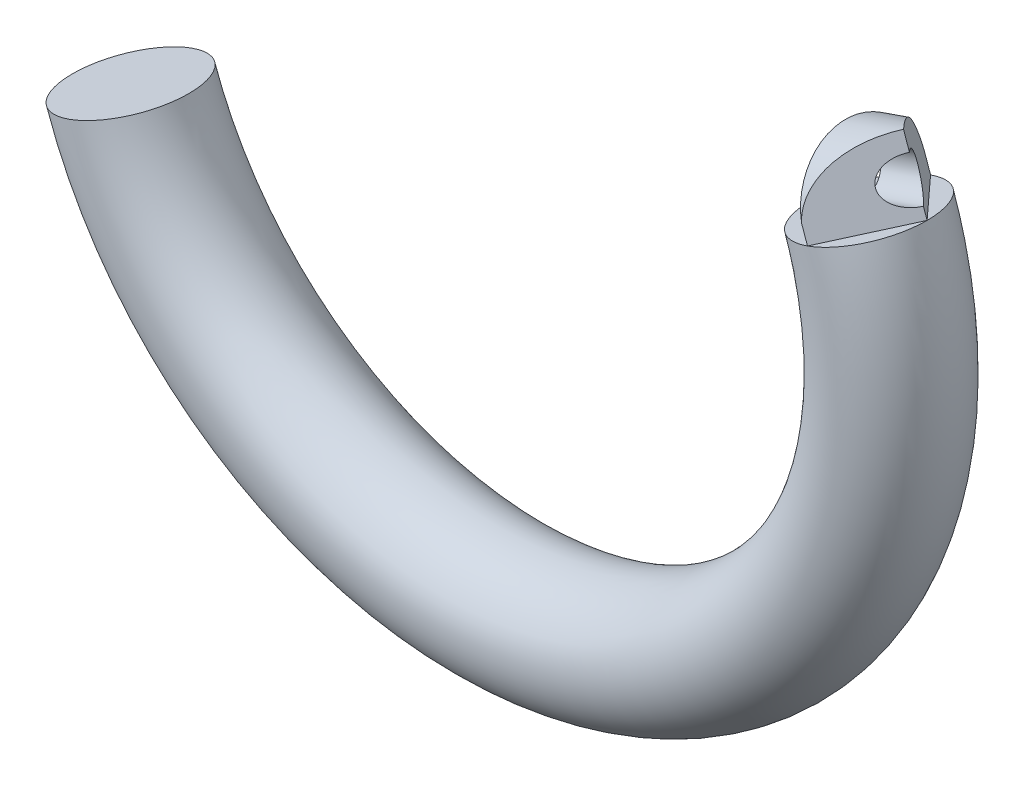
ISO-10303-21;
HEADER;
FILE_DESCRIPTION(('STEP AP214'),'2;1');
FILE_NAME('part.step','',(''),(''),'','','');
FILE_SCHEMA(('AUTOMOTIVE_DESIGN { 1 0 10303 214 1 1 1 1 }'));
ENDSEC;
DATA;
#1=APPLICATION_CONTEXT('core data for automotive mechanical design processes');
#2=APPLICATION_PROTOCOL_DEFINITION('international standard','automotive_design',2000,#1);
#3=PRODUCT_CONTEXT('',#1,'mechanical');
#4=PRODUCT('Part','Part','',(#3));
#5=PRODUCT_RELATED_PRODUCT_CATEGORY('part','',(#4));
#6=PRODUCT_DEFINITION_FORMATION('','',#4);
#7=PRODUCT_DEFINITION_CONTEXT('part definition',#1,'design');
#8=PRODUCT_DEFINITION('design','',#6,#7);
#9=PRODUCT_DEFINITION_SHAPE('','',#8);
#10=(LENGTH_UNIT() NAMED_UNIT(*) SI_UNIT(.MILLI.,.METRE.));
#11=(NAMED_UNIT(*) PLANE_ANGLE_UNIT() SI_UNIT($,.RADIAN.));
#12=(NAMED_UNIT(*) SI_UNIT($,.STERADIAN.) SOLID_ANGLE_UNIT());
#13=UNCERTAINTY_MEASURE_WITH_UNIT(LENGTH_MEASURE(1.E-05),#10,'distance_accuracy_value','');
#14=(GEOMETRIC_REPRESENTATION_CONTEXT(3) GLOBAL_UNCERTAINTY_ASSIGNED_CONTEXT((#13)) GLOBAL_UNIT_ASSIGNED_CONTEXT((#10,
#11,#12)) REPRESENTATION_CONTEXT('',''));
#15=CARTESIAN_POINT('',(0.,0.,0.));
#16=DIRECTION('',(0.,0.,1.));
#17=DIRECTION('',(1.,0.,0.));
#18=AXIS2_PLACEMENT_3D('',#15,#16,#17);
#19=CARTESIAN_POINT('',(22.0449897686221,41.8399595060842,-4.37500150229653));
#20=DIRECTION('',(0.943460139651132,0.33148599501256,0.));
#21=DIRECTION('',(-0.33148599501256,0.943460139651132,0.));
#22=AXIS2_PLACEMENT_3D('',#19,#20,#21);
#23=PLANE('',#22);
#24=CARTESIAN_POINT('',(24.6026708804798,34.5604055723353,0.));
#25=DIRECTION('',(-0.943460139651132,-0.33148599501256,0.));
#26=DIRECTION('',(0.33148599501256,-0.943460139651132,0.));
#27=AXIS2_PLACEMENT_3D('',#24,#25,#26);
#28=CIRCLE('',#27,1.5);
#29=CARTESIAN_POINT('',(25.0998998729986,33.1452153628586,0.));
#30=VERTEX_POINT('',#29);
#31=EDGE_CURVE('E84',#30,#30,#28,.T.);
#32=ORIENTED_EDGE('',*,*,#31,.F.);
#33=EDGE_LOOP('',(#32));
#34=FACE_BOUND('',#33,.T.);
#35=DIRECTION('',(0.33148599501256,-0.943460139651132,0.));
#36=VECTOR('',#35,1.);
#37=CARTESIAN_POINT('',(22.0449897686221,41.8399595060842,4.37500150229653));
#38=LINE('',#37,#36);
#39=CARTESIAN_POINT('',(24.9365709329669,33.6100746537181,4.37500150229653));
#40=VERTEX_POINT('',#39);
#41=CARTESIAN_POINT('',(25.3598497187477,32.4053581095729,4.37500150229653));
#42=VERTEX_POINT('',#41);
#43=EDGE_CURVE('E91',#40,#42,#38,.T.);
#44=ORIENTED_EDGE('',*,*,#43,.F.);
#45=CARTESIAN_POINT('',(25.1482103258572,33.0077163816457,0.));
#46=DIRECTION('',(-0.943460139651132,-0.33148599501256,0.));
#47=DIRECTION('',(0.33148599501256,-0.943460139651132,0.));
#48=AXIS2_PLACEMENT_3D('',#45,#46,#47);
#49=CIRCLE('',#48,4.42134197565105);
#50=CARTESIAN_POINT('',(24.9365709329669,33.6100746537181,-4.37500150229653));
#51=VERTEX_POINT('',#50);
#52=EDGE_CURVE('E56',#51,#40,#49,.F.);
#53=ORIENTED_EDGE('',*,*,#52,.F.);
#54=DIRECTION('',(0.33148599501256,-0.943460139651132,0.));
#55=VECTOR('',#54,1.);
#56=CARTESIAN_POINT('',(22.0449897686221,41.8399595060842,-4.37500150229653));
#57=LINE('',#56,#55);
#58=CARTESIAN_POINT('',(25.3598497187477,32.4053581095729,-4.37500150229653));
#59=VERTEX_POINT('',#58);
#60=EDGE_CURVE('E97',#51,#59,#57,.T.);
#61=ORIENTED_EDGE('',*,*,#60,.T.);
#62=DIRECTION('',(0.,0.,1.));
#63=VECTOR('',#62,1.);
#64=CARTESIAN_POINT('',(25.3598497187477,32.4053581095729,-4.37500150229653));
#65=LINE('',#64,#63);
#66=EDGE_CURVE('E92',#59,#42,#65,.T.);
#67=ORIENTED_EDGE('',*,*,#66,.T.);
#68=EDGE_LOOP('',(#44,#53,#61,#67));
#69=FACE_BOUND('',#68,.T.);
#70=ADVANCED_FACE('F35',(#34,#69),#23,.F.);
#71=CARTESIAN_POINT('',(25.3598497187477,32.4053581095729,0.));
#72=DIRECTION('',(-0.33148599501256,0.943460139651132,0.));
#73=DIRECTION('',(-0.943460139651132,-0.33148599501256,0.));
#74=AXIS2_PLACEMENT_3D('',#71,#72,#73);
#75=PLANE('',#74);
#76=CARTESIAN_POINT('',(25.3598497187477,32.4053581095729,0.));
#77=DIRECTION('',(-0.33148599501256,0.943460139651132,0.));
#78=DIRECTION('',(-0.943460139651132,-0.33148599501256,0.));
#79=AXIS2_PLACEMENT_3D('',#76,#77,#78);
#80=CIRCLE('',#79,4.37500150229653);
#81=CARTESIAN_POINT('',(29.4874892470783,33.8556098357431,0.));
#82=VERTEX_POINT('',#81);
#83=EDGE_CURVE('E104',#82,#59,#80,.T.);
#84=ORIENTED_EDGE('',*,*,#83,.T.);
#85=DIRECTION('',(-0.667127062526522,-0.234395994941751,-0.707106781186548));
#86=VECTOR('',#85,1.);
#87=CARTESIAN_POINT('',(29.4874892470783,33.8556098357431,0.));
#88=LINE('',#87,#86);
#89=EDGE_CURVE('E114',#82,#59,#88,.T.);
#90=ORIENTED_EDGE('',*,*,#89,.F.);
#91=EDGE_LOOP('',(#84,#90));
#92=FACE_BOUND('',#91,.T.);
#93=ADVANCED_FACE('F123',(#92),#75,.T.);
#94=EDGE_CURVE('E99',#59,#42,#80,.T.);
#95=ORIENTED_EDGE('',*,*,#94,.T.);
#96=ORIENTED_EDGE('',*,*,#66,.F.);
#97=EDGE_LOOP('',(#95,#96));
#98=FACE_BOUND('',#97,.T.);
#99=ADVANCED_FACE('F118',(#98),#75,.T.);
#100=EDGE_CURVE('E100',#42,#82,#80,.T.);
#101=ORIENTED_EDGE('',*,*,#100,.T.);
#102=DIRECTION('',(0.667127062526522,0.234395994941751,-0.707106781186548));
#103=VECTOR('',#102,1.);
#104=CARTESIAN_POINT('',(25.3598497187477,32.4053581095729,4.37500150229653));
#105=LINE('',#104,#103);
#106=EDGE_CURVE('E88',#42,#82,#105,.T.);
#107=ORIENTED_EDGE('',*,*,#106,.F.);
#108=EDGE_LOOP('',(#101,#107));
#109=FACE_BOUND('',#108,.T.);
#110=ADVANCED_FACE('F116',(#109),#75,.T.);
#111=CARTESIAN_POINT('',(-0.888070260685381,23.183115954637,0.));
#112=DIRECTION('',(0.,0.,1.));
#113=DIRECTION('',(1.,0.,0.));
#114=AXIS2_PLACEMENT_3D('',#111,#112,#113);
#115=TOROIDAL_SURFACE('',#114,27.8209103663233,4.37500150229653);
#116=CARTESIAN_POINT('',(-27.1359902401186,13.9608737997014,0.));
#117=DIRECTION('',(0.331485995012547,-0.943460139651137,0.));
#118=DIRECTION('',(0.943460139651137,0.331485995012547,0.));
#119=AXIS2_PLACEMENT_3D('',#116,#117,#118);
#120=CIRCLE('',#119,4.37500150229653);
#121=CARTESIAN_POINT('',(-23.0083507117879,15.4111255258716,0.));
#122=VERTEX_POINT('',#121);
#123=EDGE_CURVE('E103',#122,#122,#120,.T.);
#124=ORIENTED_EDGE('',*,*,#123,.T.);
#125=EDGE_LOOP('',(#124));
#126=FACE_BOUND('',#125,.T.);
#127=ORIENTED_EDGE('',*,*,#100,.F.);
#128=ORIENTED_EDGE('',*,*,#94,.F.);
#129=ORIENTED_EDGE('',*,*,#83,.F.);
#130=EDGE_LOOP('',(#127,#128,#129));
#131=FACE_BOUND('',#130,.T.);
#132=ADVANCED_FACE('F37',(#126,#131),#115,.T.);
#133=CARTESIAN_POINT('',(-27.1359902401186,13.9608737997014,0.));
#134=DIRECTION('',(0.331485995012547,-0.943460139651137,0.));
#135=DIRECTION('',(0.943460139651137,0.331485995012547,0.));
#136=AXIS2_PLACEMENT_3D('',#133,#134,#135);
#137=PLANE('',#136);
#138=ORIENTED_EDGE('',*,*,#123,.F.);
#139=EDGE_LOOP('',(#138));
#140=FACE_BOUND('',#139,.T.);
#141=ADVANCED_FACE('F143',(#140),#137,.F.);
#142=CARTESIAN_POINT('',(26.1726292969527,43.2902112322545,0.));
#143=DIRECTION('',(-0.667127062526523,-0.234395994941751,0.707106781186547));
#144=DIRECTION('',(0.727370447198578,0.,0.686245023692077));
#145=AXIS2_PLACEMENT_3D('',#142,#143,#144);
#146=PLANE('',#145);
#147=DIRECTION('',(0.33148599501256,-0.943460139651132,0.));
#148=VECTOR('',#147,1.);
#149=CARTESIAN_POINT('',(26.1726292969527,43.2902112322545,0.));
#150=LINE('',#149,#148);
#151=CARTESIAN_POINT('',(27.8102369100983,38.6293280256091,0.));
#152=VERTEX_POINT('',#151);
#153=CARTESIAN_POINT('',(28.2330814162915,37.4258475079822,0.));
#154=VERTEX_POINT('',#153);
#155=EDGE_CURVE('E83',#152,#154,#150,.T.);
#156=ORIENTED_EDGE('',*,*,#155,.T.);
#157=CARTESIAN_POINT('',(28.7303104088104,36.0106572985055,0.));
#158=DIRECTION('',(-0.667127062526523,-0.234395994941751,0.707106781186547));
#159=DIRECTION('',(-0.667127062526522,-0.234395994941751,-0.707106781186548));
#160=AXIS2_PLACEMENT_3D('',#157,#158,#159);
#161=ELLIPSE('',#160,2.12132034355964,1.5);
#162=CARTESIAN_POINT('',(29.2275394013292,34.5954670890288,0.));
#163=VERTEX_POINT('',#162);
#164=EDGE_CURVE('E49',#154,#163,#161,.T.);
#165=ORIENTED_EDGE('',*,*,#164,.T.);
#166=EDGE_CURVE('E80',#163,#82,#150,.T.);
#167=ORIENTED_EDGE('',*,*,#166,.T.);
#168=ORIENTED_EDGE('',*,*,#89,.T.);
#169=ORIENTED_EDGE('',*,*,#60,.F.);
#170=CARTESIAN_POINT('',(29.2758498541878,34.4579681078159,0.));
#171=DIRECTION('',(-0.667127062526523,-0.234395994941751,0.707106781186547));
#172=DIRECTION('',(-0.667127062526522,-0.234395994941751,-0.707106781186548));
#173=AXIS2_PLACEMENT_3D('',#170,#171,#172);
#174=ELLIPSE('',#173,6.25272178585516,4.42134197565105);
#175=EDGE_CURVE('E124',#51,#152,#174,.F.);
#176=ORIENTED_EDGE('',*,*,#175,.T.);
#177=EDGE_LOOP('',(#156,#165,#167,#168,#169,#176));
#178=FACE_BOUND('',#177,.T.);
#179=ADVANCED_FACE('F78',(#178),#146,.F.);
#180=CARTESIAN_POINT('',(22.0449897686221,41.8399595060842,4.37500150229653));
#181=DIRECTION('',(-0.667127062526523,-0.234395994941751,-0.707106781186547));
#182=DIRECTION('',(-0.727370447198578,0.,0.686245023692077));
#183=AXIS2_PLACEMENT_3D('',#180,#181,#182);
#184=PLANE('',#183);
#185=ORIENTED_EDGE('',*,*,#166,.F.);
#186=CARTESIAN_POINT('',(28.7303104088104,36.0106572985055,0.));
#187=DIRECTION('',(-0.667127062526523,-0.234395994941751,-0.707106781186547));
#188=DIRECTION('',(-0.667127062526522,-0.234395994941751,0.707106781186548));
#189=AXIS2_PLACEMENT_3D('',#186,#187,#188);
#190=ELLIPSE('',#189,2.12132034355964,1.5);
#191=EDGE_CURVE('E11',#163,#154,#190,.T.);
#192=ORIENTED_EDGE('',*,*,#191,.T.);
#193=ORIENTED_EDGE('',*,*,#155,.F.);
#194=CARTESIAN_POINT('',(29.2758498541878,34.4579681078159,0.));
#195=DIRECTION('',(-0.667127062526523,-0.234395994941751,-0.707106781186547));
#196=DIRECTION('',(-0.667127062526522,-0.234395994941751,0.707106781186548));
#197=AXIS2_PLACEMENT_3D('',#194,#195,#196);
#198=ELLIPSE('',#197,6.25272178585516,4.42134197565105);
#199=EDGE_CURVE('E43',#152,#40,#198,.F.);
#200=ORIENTED_EDGE('',*,*,#199,.T.);
#201=ORIENTED_EDGE('',*,*,#43,.T.);
#202=ORIENTED_EDGE('',*,*,#106,.T.);
#203=EDGE_LOOP('',(#185,#192,#193,#200,#201,#202));
#204=FACE_BOUND('',#203,.T.);
#205=ADVANCED_FACE('F86',(#204),#184,.F.);
#206=CARTESIAN_POINT('',(34.5828117223685,36.3225763317713,0.));
#207=DIRECTION('',(-0.943460139651132,-0.33148599501256,0.));
#208=DIRECTION('',(0.33148599501256,-0.943460139651132,0.));
#209=AXIS2_PLACEMENT_3D('',#206,#207,#208);
#210=CYLINDRICAL_SURFACE('',#209,4.42134197565105);
#211=ORIENTED_EDGE('',*,*,#52,.T.);
#212=ORIENTED_EDGE('',*,*,#199,.F.);
#213=ORIENTED_EDGE('',*,*,#175,.F.);
#214=EDGE_LOOP('',(#211,#212,#213));
#215=FACE_BOUND('',#214,.T.);
#216=ADVANCED_FACE('F185',(#215),#210,.T.);
#217=CARTESIAN_POINT('',(34.0372722769911,37.8752655224609,0.));
#218=DIRECTION('',(-0.943460139651132,-0.33148599501256,0.));
#219=DIRECTION('',(0.33148599501256,-0.943460139651132,0.));
#220=AXIS2_PLACEMENT_3D('',#217,#218,#219);
#221=CYLINDRICAL_SURFACE('',#220,1.5);
#222=ORIENTED_EDGE('',*,*,#31,.T.);
#223=EDGE_LOOP('',(#222));
#224=FACE_BOUND('',#223,.T.);
#225=ORIENTED_EDGE('',*,*,#191,.F.);
#226=ORIENTED_EDGE('',*,*,#164,.F.);
#227=EDGE_LOOP('',(#225,#226));
#228=FACE_BOUND('',#227,.T.);
#229=ADVANCED_FACE('F72',(#224,#228),#221,.F.);
#230=CLOSED_SHELL('',(#70,#93,#99,#110,#132,#141,#179,#205,#216,#229));
#231=MANIFOLD_SOLID_BREP('B2',#230);
#232=ADVANCED_BREP_SHAPE_REPRESENTATION('',(#18,#231),#14);
#233=SHAPE_DEFINITION_REPRESENTATION(#9,#232);
ENDSEC;
END-ISO-10303-21;
